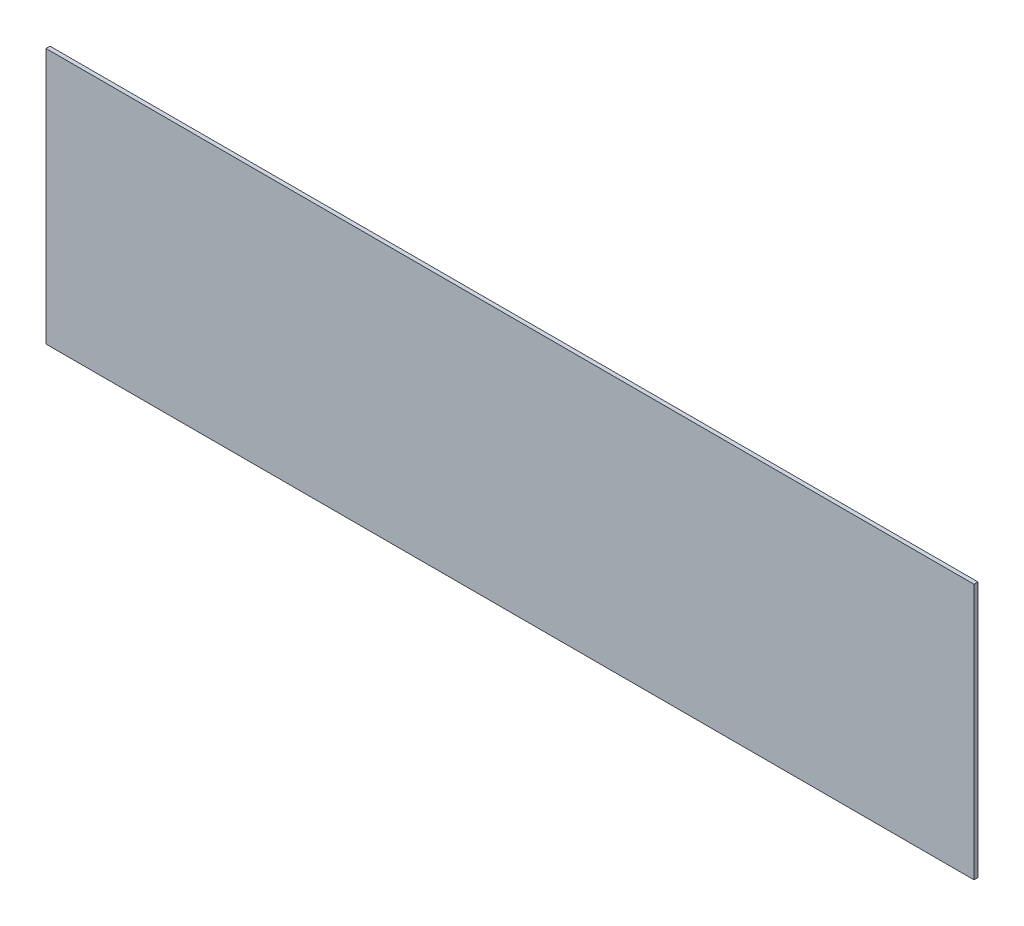
ISO-10303-21;
HEADER;
FILE_DESCRIPTION(('STEP AP214'),'2;1');
FILE_NAME('part.step','',(''),(''),'','','');
FILE_SCHEMA(('AUTOMOTIVE_DESIGN { 1 0 10303 214 1 1 1 1 }'));
ENDSEC;
DATA;
#1=APPLICATION_CONTEXT('core data for automotive mechanical design processes');
#2=APPLICATION_PROTOCOL_DEFINITION('international standard','automotive_design',2000,#1);
#3=PRODUCT_CONTEXT('',#1,'mechanical');
#4=PRODUCT('Part','Part','',(#3));
#5=PRODUCT_RELATED_PRODUCT_CATEGORY('part','',(#4));
#6=PRODUCT_DEFINITION_FORMATION('','',#4);
#7=PRODUCT_DEFINITION_CONTEXT('part definition',#1,'design');
#8=PRODUCT_DEFINITION('design','',#6,#7);
#9=PRODUCT_DEFINITION_SHAPE('','',#8);
#10=(LENGTH_UNIT() NAMED_UNIT(*) SI_UNIT(.MILLI.,.METRE.));
#11=(NAMED_UNIT(*) PLANE_ANGLE_UNIT() SI_UNIT($,.RADIAN.));
#12=(NAMED_UNIT(*) SI_UNIT($,.STERADIAN.) SOLID_ANGLE_UNIT());
#13=UNCERTAINTY_MEASURE_WITH_UNIT(LENGTH_MEASURE(1.E-05),#10,'distance_accuracy_value','');
#14=(GEOMETRIC_REPRESENTATION_CONTEXT(3) GLOBAL_UNCERTAINTY_ASSIGNED_CONTEXT((#13)) GLOBAL_UNIT_ASSIGNED_CONTEXT((#10,
#11,#12)) REPRESENTATION_CONTEXT('',''));
#15=CARTESIAN_POINT('',(0.,0.,0.));
#16=DIRECTION('',(0.,0.,1.));
#17=DIRECTION('',(1.,0.,0.));
#18=AXIS2_PLACEMENT_3D('',#15,#16,#17);
#19=CARTESIAN_POINT('',(368.3,-101.6,3.175));
#20=DIRECTION('',(-1.,0.,0.));
#21=DIRECTION('',(0.,0.,1.));
#22=AXIS2_PLACEMENT_3D('',#19,#20,#21);
#23=PLANE('',#22);
#24=DIRECTION('',(0.,1.,0.));
#25=VECTOR('',#24,1.);
#26=CARTESIAN_POINT('',(368.3,-101.6,0.));
#27=LINE('',#26,#25);
#28=CARTESIAN_POINT('',(368.3,-101.6,0.));
#29=VERTEX_POINT('',#28);
#30=CARTESIAN_POINT('',(368.3,101.6,0.));
#31=VERTEX_POINT('',#30);
#32=EDGE_CURVE('E102',#29,#31,#27,.T.);
#33=ORIENTED_EDGE('',*,*,#32,.T.);
#34=DIRECTION('',(0.,0.,-1.));
#35=VECTOR('',#34,1.);
#36=CARTESIAN_POINT('',(368.3,101.6,3.175));
#37=LINE('',#36,#35);
#38=CARTESIAN_POINT('',(368.3,101.6,3.175));
#39=VERTEX_POINT('',#38);
#40=EDGE_CURVE('E11',#39,#31,#37,.T.);
#41=ORIENTED_EDGE('',*,*,#40,.F.);
#42=DIRECTION('',(0.,1.,0.));
#43=VECTOR('',#42,1.);
#44=CARTESIAN_POINT('',(368.3,-101.6,3.175));
#45=LINE('',#44,#43);
#46=CARTESIAN_POINT('',(368.3,-101.6,3.175));
#47=VERTEX_POINT('',#46);
#48=EDGE_CURVE('E90',#47,#39,#45,.T.);
#49=ORIENTED_EDGE('',*,*,#48,.F.);
#50=DIRECTION('',(0.,0.,-1.));
#51=VECTOR('',#50,1.);
#52=CARTESIAN_POINT('',(368.3,-101.6,3.175));
#53=LINE('',#52,#51);
#54=EDGE_CURVE('E98',#47,#29,#53,.T.);
#55=ORIENTED_EDGE('',*,*,#54,.T.);
#56=EDGE_LOOP('',(#33,#41,#49,#55));
#57=FACE_BOUND('',#56,.T.);
#58=ADVANCED_FACE('F39',(#57),#23,.F.);
#59=CARTESIAN_POINT('',(-368.3,101.6,3.175));
#60=DIRECTION('',(0.,-1.,0.));
#61=DIRECTION('',(0.,0.,-1.));
#62=AXIS2_PLACEMENT_3D('',#59,#60,#61);
#63=PLANE('',#62);
#64=DIRECTION('',(-1.,0.,0.));
#65=VECTOR('',#64,1.);
#66=CARTESIAN_POINT('',(-368.3,101.6,0.));
#67=LINE('',#66,#65);
#68=CARTESIAN_POINT('',(-368.3,101.6,0.));
#69=VERTEX_POINT('',#68);
#70=EDGE_CURVE('E94',#31,#69,#67,.T.);
#71=ORIENTED_EDGE('',*,*,#70,.T.);
#72=DIRECTION('',(0.,0.,-1.));
#73=VECTOR('',#72,1.);
#74=CARTESIAN_POINT('',(-368.3,101.6,3.175));
#75=LINE('',#74,#73);
#76=CARTESIAN_POINT('',(-368.3,101.6,3.175));
#77=VERTEX_POINT('',#76);
#78=EDGE_CURVE('E47',#77,#69,#75,.T.);
#79=ORIENTED_EDGE('',*,*,#78,.F.);
#80=DIRECTION('',(-1.,0.,0.));
#81=VECTOR('',#80,1.);
#82=CARTESIAN_POINT('',(-368.3,101.6,3.175));
#83=LINE('',#82,#81);
#84=EDGE_CURVE('E85',#39,#77,#83,.T.);
#85=ORIENTED_EDGE('',*,*,#84,.F.);
#86=ORIENTED_EDGE('',*,*,#40,.T.);
#87=EDGE_LOOP('',(#71,#79,#85,#86));
#88=FACE_BOUND('',#87,.T.);
#89=ADVANCED_FACE('F93',(#88),#63,.F.);
#90=CARTESIAN_POINT('',(-368.3,-101.6,3.175));
#91=DIRECTION('',(1.,0.,0.));
#92=DIRECTION('',(0.,0.,-1.));
#93=AXIS2_PLACEMENT_3D('',#90,#91,#92);
#94=PLANE('',#93);
#95=DIRECTION('',(0.,-1.,0.));
#96=VECTOR('',#95,1.);
#97=CARTESIAN_POINT('',(-368.3,-101.6,0.));
#98=LINE('',#97,#96);
#99=CARTESIAN_POINT('',(-368.3,-101.6,0.));
#100=VERTEX_POINT('',#99);
#101=EDGE_CURVE('E72',#69,#100,#98,.T.);
#102=ORIENTED_EDGE('',*,*,#101,.T.);
#103=DIRECTION('',(0.,0.,-1.));
#104=VECTOR('',#103,1.);
#105=CARTESIAN_POINT('',(-368.3,-101.6,3.175));
#106=LINE('',#105,#104);
#107=CARTESIAN_POINT('',(-368.3,-101.6,3.175));
#108=VERTEX_POINT('',#107);
#109=EDGE_CURVE('E95',#108,#100,#106,.T.);
#110=ORIENTED_EDGE('',*,*,#109,.F.);
#111=DIRECTION('',(0.,-1.,0.));
#112=VECTOR('',#111,1.);
#113=CARTESIAN_POINT('',(-368.3,-101.6,3.175));
#114=LINE('',#113,#112);
#115=EDGE_CURVE('E88',#77,#108,#114,.T.);
#116=ORIENTED_EDGE('',*,*,#115,.F.);
#117=ORIENTED_EDGE('',*,*,#78,.T.);
#118=EDGE_LOOP('',(#102,#110,#116,#117));
#119=FACE_BOUND('',#118,.T.);
#120=ADVANCED_FACE('F96',(#119),#94,.F.);
#121=CARTESIAN_POINT('',(-368.3,-101.6,3.175));
#122=DIRECTION('',(0.,1.,0.));
#123=DIRECTION('',(0.,0.,1.));
#124=AXIS2_PLACEMENT_3D('',#121,#122,#123);
#125=PLANE('',#124);
#126=DIRECTION('',(1.,0.,0.));
#127=VECTOR('',#126,1.);
#128=CARTESIAN_POINT('',(-368.3,-101.6,0.));
#129=LINE('',#128,#127);
#130=EDGE_CURVE('E78',#100,#29,#129,.T.);
#131=ORIENTED_EDGE('',*,*,#130,.T.);
#132=ORIENTED_EDGE('',*,*,#54,.F.);
#133=DIRECTION('',(1.,0.,0.));
#134=VECTOR('',#133,1.);
#135=CARTESIAN_POINT('',(-368.3,-101.6,3.175));
#136=LINE('',#135,#134);
#137=EDGE_CURVE('E55',#108,#47,#136,.T.);
#138=ORIENTED_EDGE('',*,*,#137,.F.);
#139=ORIENTED_EDGE('',*,*,#109,.T.);
#140=EDGE_LOOP('',(#131,#132,#138,#139));
#141=FACE_BOUND('',#140,.T.);
#142=ADVANCED_FACE('F109',(#141),#125,.F.);
#143=CARTESIAN_POINT('',(0.,0.,3.175));
#144=DIRECTION('',(0.,0.,-1.));
#145=DIRECTION('',(-1.,0.,0.));
#146=AXIS2_PLACEMENT_3D('',#143,#144,#145);
#147=PLANE('',#146);
#148=ORIENTED_EDGE('',*,*,#48,.T.);
#149=ORIENTED_EDGE('',*,*,#84,.T.);
#150=ORIENTED_EDGE('',*,*,#115,.T.);
#151=ORIENTED_EDGE('',*,*,#137,.T.);
#152=EDGE_LOOP('',(#148,#149,#150,#151));
#153=FACE_BOUND('',#152,.T.);
#154=ADVANCED_FACE('F86',(#153),#147,.F.);
#155=CARTESIAN_POINT('',(0.,0.,0.));
#156=DIRECTION('',(0.,0.,-1.));
#157=DIRECTION('',(-1.,0.,0.));
#158=AXIS2_PLACEMENT_3D('',#155,#156,#157);
#159=PLANE('',#158);
#160=ORIENTED_EDGE('',*,*,#32,.F.);
#161=ORIENTED_EDGE('',*,*,#130,.F.);
#162=ORIENTED_EDGE('',*,*,#101,.F.);
#163=ORIENTED_EDGE('',*,*,#70,.F.);
#164=EDGE_LOOP('',(#160,#161,#162,#163));
#165=FACE_BOUND('',#164,.T.);
#166=ADVANCED_FACE('F112',(#165),#159,.T.);
#167=CLOSED_SHELL('',(#58,#89,#120,#142,#154,#166));
#168=MANIFOLD_SOLID_BREP('B2',#167);
#169=ADVANCED_BREP_SHAPE_REPRESENTATION('',(#18,#168),#14);
#170=SHAPE_DEFINITION_REPRESENTATION(#9,#169);
ENDSEC;
END-ISO-10303-21;
